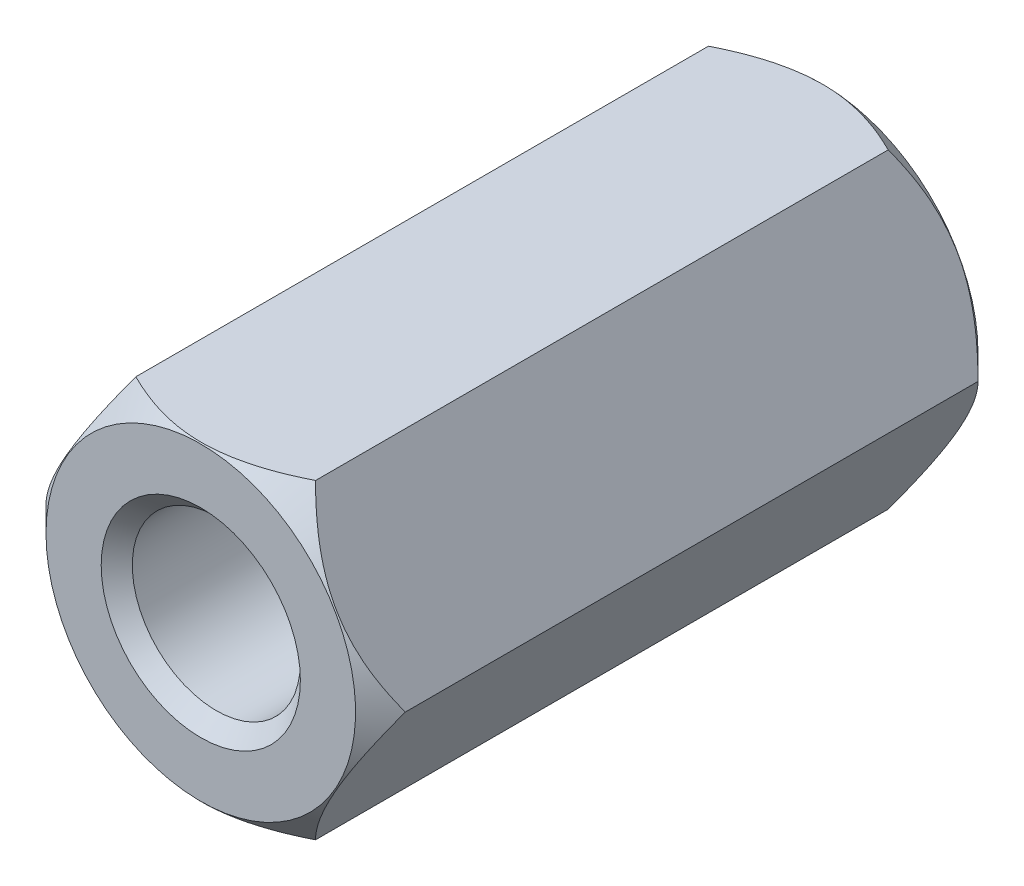
ISO-10303-21;
HEADER;
FILE_DESCRIPTION(('STEP AP214'),'2;1');
FILE_NAME('part.step','',(''),(''),'','','');
FILE_SCHEMA(('AUTOMOTIVE_DESIGN { 1 0 10303 214 1 1 1 1 }'));
ENDSEC;
DATA;
#1=APPLICATION_CONTEXT('core data for automotive mechanical design processes');
#2=APPLICATION_PROTOCOL_DEFINITION('international standard','automotive_design',2000,#1);
#3=PRODUCT_CONTEXT('',#1,'mechanical');
#4=PRODUCT('Part','Part','',(#3));
#5=PRODUCT_RELATED_PRODUCT_CATEGORY('part','',(#4));
#6=PRODUCT_DEFINITION_FORMATION('','',#4);
#7=PRODUCT_DEFINITION_CONTEXT('part definition',#1,'design');
#8=PRODUCT_DEFINITION('design','',#6,#7);
#9=PRODUCT_DEFINITION_SHAPE('','',#8);
#10=(LENGTH_UNIT() NAMED_UNIT(*) SI_UNIT(.MILLI.,.METRE.));
#11=(NAMED_UNIT(*) PLANE_ANGLE_UNIT() SI_UNIT($,.RADIAN.));
#12=(NAMED_UNIT(*) SI_UNIT($,.STERADIAN.) SOLID_ANGLE_UNIT());
#13=UNCERTAINTY_MEASURE_WITH_UNIT(LENGTH_MEASURE(1.E-05),#10,'distance_accuracy_value','');
#14=(GEOMETRIC_REPRESENTATION_CONTEXT(3) GLOBAL_UNCERTAINTY_ASSIGNED_CONTEXT((#13)) GLOBAL_UNIT_ASSIGNED_CONTEXT((#10,
#11,#12)) REPRESENTATION_CONTEXT('',''));
#15=CARTESIAN_POINT('',(0.,0.,0.));
#16=DIRECTION('',(0.,0.,1.));
#17=DIRECTION('',(1.,0.,0.));
#18=AXIS2_PLACEMENT_3D('',#15,#16,#17);
#19=CARTESIAN_POINT('',(1.44337567297409,-2.49999999999998,5.));
#20=DIRECTION('',(-0.866025403784442,0.499999999999995,0.));
#21=DIRECTION('',(-0.499999999999995,-0.866025403784442,0.));
#22=AXIS2_PLACEMENT_3D('',#19,#20,#21);
#23=PLANE('',#22);
#24=DIRECTION('',(0.,0.,1.));
#25=VECTOR('',#24,1.);
#26=CARTESIAN_POINT('',(1.44337567297409,-2.49999999999998,5.));
#27=LINE('',#26,#25);
#28=CARTESIAN_POINT('',(1.44337563619233,-2.49999999999998,4.60000001832259));
#29=VERTEX_POINT('',#28);
#30=CARTESIAN_POINT('',(1.44337569137427,-2.49999996812994,-4.60000001833188));
#31=VERTEX_POINT('',#30);
#32=EDGE_CURVE('E230',#29,#31,#27,.F.);
#33=ORIENTED_EDGE('',*,*,#32,.T.);
#34=CARTESIAN_POINT('',(2.88675134591674,-4.02492549421299E-11,-4.59999999995311));
#35=CARTESIAN_POINT('',(2.8371418191618,-0.0859262209282958,-4.64956191743451));
#36=CARTESIAN_POINT('',(2.78670282009929,-0.173289129991202,-4.69621249943633));
#37=CARTESIAN_POINT('',(2.68385252484558,-0.351431066946827,-4.78162772356207));
#38=CARTESIAN_POINT('',(2.6314314529305,-0.442227026889953,-4.82034485621288));
#39=CARTESIAN_POINT('',(2.52572693265171,-0.625312626601804,-4.88666756500361));
#40=CARTESIAN_POINT('',(2.47247038953042,-0.717555665123614,-4.91443979576514));
#41=CARTESIAN_POINT('',(2.3647851861995,-0.90407190851635,-4.95722820687064));
#42=CARTESIAN_POINT('',(2.31035981325302,-0.998339419680469,-4.97227631517235));
#43=CARTESIAN_POINT('',(2.21655517569261,-1.16081381792064,-4.98585394944047));
#44=CARTESIAN_POINT('',(2.17729701313156,-1.22881095008819,-4.98786327173912));
#45=CARTESIAN_POINT('',(2.09884492069937,-1.36469396014085,-4.98447379968523));
#46=CARTESIAN_POINT('',(2.05965101816243,-1.43257979068173,-4.97907240872174));
#47=CARTESIAN_POINT('',(1.98163336093589,-1.56771033688559,-4.96116888901889));
#48=CARTESIAN_POINT('',(1.94281006951908,-1.63495425013656,-4.94865882131304));
#49=CARTESIAN_POINT('',(1.86583485788668,-1.76827922760725,-4.91722463172509));
#50=CARTESIAN_POINT('',(1.82768288641831,-1.83436038059938,-4.89830100174918));
#51=CARTESIAN_POINT('',(1.72998211153546,-2.00358308663533,-4.84213570255329));
#52=CARTESIAN_POINT('',(1.67103848734125,-2.10567643852194,-4.80066503724302));
#53=CARTESIAN_POINT('',(1.58436641863861,-2.25579686511202,-4.73065889043091));
#54=CARTESIAN_POINT('',(1.55580401039688,-2.30526840737322,-4.70606226595184));
#55=CARTESIAN_POINT('',(1.49920805534924,-2.40329547701863,-4.6546271777928));
#56=CARTESIAN_POINT('',(1.47117419716232,-2.45185154373055,-4.62779008804468));
#57=CARTESIAN_POINT('',(1.44337570977445,-2.4999999362599,-4.60000003673206));
#58=B_SPLINE_CURVE_WITH_KNOTS('',3,(#34,#35,#36,#37,#38,#39,#40,#41,#42,#43,#44,#45,#46,#47,#48,
#49,#50,#51,#52,#53,#54,#55,#56,#57),.UNSPECIFIED.,.F.,.F.,(4,2,2,2,2,2,2,2,2,2,2,4),(0.,
0.332957366229107,0.667853853220549,0.997433316790218,1.32618330920712,1.56147590697787,
1.79685096906297,2.03248941598652,2.26810979404505,2.64223178456954,2.82878531065978,
3.01522526430085),.UNSPECIFIED.);
#59=CARTESIAN_POINT('',(2.88675134590709,0.,-4.60000000001263));
#60=VERTEX_POINT('',#59);
#61=EDGE_CURVE('E95',#60,#31,#58,.T.);
#62=ORIENTED_EDGE('',*,*,#61,.F.);
#63=DIRECTION('',(0.,0.,1.));
#64=VECTOR('',#63,1.);
#65=CARTESIAN_POINT('',(2.88675134594813,0.,5.));
#66=LINE('',#65,#64);
#67=CARTESIAN_POINT('',(2.88675134590709,0.,4.60000000001492));
#68=VERTEX_POINT('',#67);
#69=EDGE_CURVE('E65',#60,#68,#66,.T.);
#70=ORIENTED_EDGE('',*,*,#69,.T.);
#71=CARTESIAN_POINT('',(1.44337563569214,-2.50000000335731,4.59999997237826));
#72=CARTESIAN_POINT('',(1.49298517776513,-2.41407379513614,4.64956189965564));
#73=CARTESIAN_POINT('',(1.54342418333479,-2.32671089091906,4.69621248633862));
#74=CARTESIAN_POINT('',(1.64627448377127,-2.14856895685303,4.78162771524642));
#75=CARTESIAN_POINT('',(1.69869555431391,-2.05777299491776,4.82034484798485));
#76=CARTESIAN_POINT('',(1.80440007386032,-1.87468739333722,4.88666755810053));
#77=CARTESIAN_POINT('',(1.85765661758234,-1.78244435491911,4.91443979011118));
#78=CARTESIAN_POINT('',(1.96534182164683,-1.59592811107846,4.95722820342519));
#79=CARTESIAN_POINT('',(2.01976719472833,-1.50166059936262,4.97227631267816));
#80=CARTESIAN_POINT('',(2.11357183231561,-1.33918620091644,4.98585394851478));
#81=CARTESIAN_POINT('',(2.15282999470817,-1.2711890690894,4.98786327150813));
#82=CARTESIAN_POINT('',(2.23128208679937,-1.13530605966303,4.98447380088798));
#83=CARTESIAN_POINT('',(2.27047598916384,-1.06742022940783,4.97907241066636));
#84=CARTESIAN_POINT('',(2.3484936461365,-0.932289683634123,4.96116889245618));
#85=CARTESIAN_POINT('',(2.3873169374714,-0.86504577052851,4.94865882549196));
#86=CARTESIAN_POINT('',(2.46429214896885,-0.731720793294173,4.91722463734702));
#87=CARTESIAN_POINT('',(2.50244412038407,-0.665639640393218,4.89830100807152));
#88=CARTESIAN_POINT('',(2.60014490401217,-0.496416919208966,4.84213570551786));
#89=CARTESIAN_POINT('',(2.65908853672277,-0.39432355257206,4.80066503403214));
#90=CARTESIAN_POINT('',(2.74576061767448,-0.244203104766166,4.7306588759134));
#91=CARTESIAN_POINT('',(2.77432302989559,-0.194731555612454,4.70606224734313));
#92=CARTESIAN_POINT('',(2.83091899275045,-0.0967044724444769,4.65462715046795));
#93=CARTESIAN_POINT('',(2.85895285476548,-0.0481483991020447,4.62779005609599));
#94=CARTESIAN_POINT('',(2.88675134592334,-4.29361050780274E-11,4.5999999999565));
#95=B_SPLINE_CURVE_WITH_KNOTS('',3,(#71,#72,#73,#74,#75,#76,#77,#78,#79,#80,#81,#82,#83,#84,#85,
#86,#87,#88,#89,#90,#91,#92,#93,#94),.UNSPECIFIED.,.F.,.F.,(4,2,2,2,2,2,2,2,2,2,2,4),(0.,
0.332957369520453,0.667853859287211,0.997433324568728,1.32618331892462,1.56147591563137,
1.79685097656311,2.03248942263669,2.26810979988192,2.64223184439898,2.82878539726489,
3.01522537760101),.UNSPECIFIED.);
#96=EDGE_CURVE('E94',#29,#68,#95,.T.);
#97=ORIENTED_EDGE('',*,*,#96,.F.);
#98=EDGE_LOOP('',(#33,#62,#70,#97));
#99=FACE_BOUND('',#98,.T.);
#100=ADVANCED_FACE('F47',(#99),#23,.F.);
#101=CARTESIAN_POINT('',(-1.44337567297404,-2.50000000000001,5.));
#102=DIRECTION('',(0.,1.,0.));
#103=DIRECTION('',(-1.,0.,0.));
#104=AXIS2_PLACEMENT_3D('',#101,#102,#103);
#105=PLANE('',#104);
#106=DIRECTION('',(0.,0.,1.));
#107=VECTOR('',#106,1.);
#108=CARTESIAN_POINT('',(-1.44337567297404,-2.50000000000002,5.));
#109=LINE('',#108,#107);
#110=CARTESIAN_POINT('',(-1.44337569137166,-2.49999996813441,4.60000001832932));
#111=VERTEX_POINT('',#110);
#112=CARTESIAN_POINT('',(-1.44337563619207,-2.50000000000002,-4.6000000183227));
#113=VERTEX_POINT('',#112);
#114=EDGE_CURVE('E351',#111,#113,#109,.F.);
#115=ORIENTED_EDGE('',*,*,#114,.T.);
#116=CARTESIAN_POINT('',(1.44337569447336,-2.49999996937073,-4.59999997239148));
#117=CARTESIAN_POINT('',(1.34415664433493,-2.49999998897878,-4.64956189964083));
#118=CARTESIAN_POINT('',(1.24327864721911,-2.49999999704067,-4.69621248629585));
#119=CARTESIAN_POINT('',(1.03757805676238,-2.50000000297654,-4.78162771515671));
#120=CARTESIAN_POINT('',(0.932735911966666,-2.50000000079093,-4.82034484787619));
#121=CARTESIAN_POINT('',(0.721326870173406,-2.49999999922161,-4.88666755801373));
#122=CARTESIAN_POINT('',(0.614813783659037,-2.49999999979398,-4.91443979005194));
#123=CARTESIAN_POINT('',(0.39944337611681,-2.50000000020549,-4.9572282034068));
#124=CARTESIAN_POINT('',(0.290592629614107,-2.50000000004649,-4.97227631267311));
#125=CARTESIAN_POINT('',(0.102983354212486,-2.49999999996672,-4.9858539485164));
#126=CARTESIAN_POINT('',(0.0244670294454347,-2.49999999999108,-4.98786327150934));
#127=CARTESIAN_POINT('',(-0.13243715475442,-2.50000000000892,-4.9844738008838));
#128=CARTESIAN_POINT('',(-0.21082495951892,-2.5000000000024,-4.97907241065717));
#129=CARTESIAN_POINT('',(-0.366860273471372,-2.49999999999761,-4.96116889243852));
#130=CARTESIAN_POINT('',(-0.444506856113246,-2.49999999999935,-4.94865882547525));
#131=CARTESIAN_POINT('',(-0.598457279056687,-2.50000000000066,-4.91722463733641));
#132=CARTESIAN_POINT('',(-0.674761221863618,-2.50000000000021,-4.89830100806614));
#133=CARTESIAN_POINT('',(-0.870162775889693,-2.49999999999968,-4.84213570931604));
#134=CARTESIAN_POINT('',(-0.988050028541752,-2.49999999999994,-4.80066504317144));
#135=CARTESIAN_POINT('',(-1.161394172063,-2.50000000000004,-4.73065889450614));
#136=CARTESIAN_POINT('',(-1.21851899052129,-2.50000000000003,-4.706062269318));
#137=CARTESIAN_POINT('',(-1.33171090449126,-2.5,-4.65462717957893));
#138=CARTESIAN_POINT('',(-1.38777862276505,-2.49999999999998,-4.62779008896007));
#139=CARTESIAN_POINT('',(-1.44337559941009,-2.50000000000001,-4.60000003671368));
#140=B_SPLINE_CURVE_WITH_KNOTS('',3,(#116,#117,#118,#119,#120,#121,#122,#123,#124,#125,#126,
#127,#128,#129,#130,#131,#132,#133,#134,#135,#136,#137,#138,#139),.UNSPECIFIED.,.F.,.F.,(4,2,2,
2,2,2,2,2,2,2,2,4),(0.,0.332957369297533,0.667853858841152,0.997433324319791,1.32618331887115,
1.56147591564986,1.7968509766547,2.03248942265513,2.26810979982337,2.64223180313988,
2.82878533550999,3.01522529541622),.UNSPECIFIED.);
#141=EDGE_CURVE('E256',#31,#113,#140,.T.);
#142=ORIENTED_EDGE('',*,*,#141,.F.);
#143=ORIENTED_EDGE('',*,*,#32,.F.);
#144=CARTESIAN_POINT('',(-1.44337569449169,-2.49999996937692,4.59999997238567));
#145=CARTESIAN_POINT('',(-1.34415664435122,-2.49999998898103,4.64956189963431));
#146=CARTESIAN_POINT('',(-1.24327864723382,-2.49999999704129,4.69621248628963));
#147=CARTESIAN_POINT('',(-1.03757805677417,-2.50000000297597,4.78162771515189));
#148=CARTESIAN_POINT('',(-0.932735911977128,-2.50000000079079,4.82034484787248));
#149=CARTESIAN_POINT('',(-0.721326870180993,-2.49999999922178,4.88666755801174));
#150=CARTESIAN_POINT('',(-0.61481378366508,-2.49999999979403,4.91443979005057));
#151=CARTESIAN_POINT('',(-0.399443376119731,-2.50000000020546,4.95722820340637));
#152=CARTESIAN_POINT('',(-0.290592629615449,-2.50000000004649,4.97227631267301));
#153=CARTESIAN_POINT('',(-0.102983354212091,-2.49999999996673,4.98585394851642));
#154=CARTESIAN_POINT('',(-0.0244670294448954,-2.49999999999108,4.98786327150935));
#155=CARTESIAN_POINT('',(0.132437154755252,-2.50000000000892,4.98447380088377));
#156=CARTESIAN_POINT('',(0.210824959519899,-2.50000000000239,4.9790724106571));
#157=CARTESIAN_POINT('',(0.366860273472621,-2.4999999999976,4.96116889243835));
#158=CARTESIAN_POINT('',(0.444506856114617,-2.49999999999934,4.94865882547502));
#159=CARTESIAN_POINT('',(0.598457279058291,-2.50000000000064,4.91722463733605));
#160=CARTESIAN_POINT('',(0.674761221865334,-2.5000000000002,4.89830100806571));
#161=CARTESIAN_POINT('',(0.87016277589126,-2.49999999999966,4.84213570931553));
#162=CARTESIAN_POINT('',(0.988050028543065,-2.49999999999992,4.80066504317097));
#163=CARTESIAN_POINT('',(1.16139417206397,-2.50000000000002,4.73065889450575));
#164=CARTESIAN_POINT('',(1.21851899052215,-2.5,4.70606226931764));
#165=CARTESIAN_POINT('',(1.33171090449192,-2.49999999999997,4.65462717957864));
#166=CARTESIAN_POINT('',(1.38777862276561,-2.49999999999995,4.62779008895982));
#167=CARTESIAN_POINT('',(1.44337559941056,-2.49999999999998,4.60000003671347));
#168=B_SPLINE_CURVE_WITH_KNOTS('',3,(#144,#145,#146,#147,#148,#149,#150,#151,#152,#153,#154,
#155,#156,#157,#158,#159,#160,#161,#162,#163,#164,#165,#166,#167),.UNSPECIFIED.,.F.,.F.,(4,2,2,
2,2,2,2,2,2,2,2,4),(0.,0.332957369302233,0.667853858850776,0.997433324334313,1.32618331889047,
1.5614759156696,1.7968509766749,2.03248942267571,2.26810979984433,2.6422318031601,
2.82878533552989,3.0152252954358),.UNSPECIFIED.);
#169=EDGE_CURVE('E110',#111,#29,#168,.T.);
#170=ORIENTED_EDGE('',*,*,#169,.F.);
#171=EDGE_LOOP('',(#115,#142,#143,#170));
#172=FACE_BOUND('',#171,.T.);
#173=ADVANCED_FACE('F182',(#172),#105,.F.);
#174=CARTESIAN_POINT('',(-2.88675134594813,0.,5.));
#175=DIRECTION('',(0.866025403784435,0.500000000000007,0.));
#176=DIRECTION('',(-0.500000000000007,0.866025403784435,0.));
#177=AXIS2_PLACEMENT_3D('',#174,#175,#176);
#178=PLANE('',#177);
#179=DIRECTION('',(0.,0.,1.));
#180=VECTOR('',#179,1.);
#181=CARTESIAN_POINT('',(-2.88675134594813,0.,5.));
#182=LINE('',#181,#180);
#183=CARTESIAN_POINT('',(-2.88675134590709,0.,4.60000000001492));
#184=VERTEX_POINT('',#183);
#185=CARTESIAN_POINT('',(-2.88675134591028,0.,-4.6000000000106));
#186=VERTEX_POINT('',#185);
#187=EDGE_CURVE('E348',#184,#186,#182,.F.);
#188=ORIENTED_EDGE('',*,*,#187,.T.);
#189=CARTESIAN_POINT('',(-1.44337563569177,-2.5000000033576,-4.59999997237799));
#190=CARTESIAN_POINT('',(-1.49298517776484,-2.41407379513648,-4.64956189965543));
#191=CARTESIAN_POINT('',(-1.54342418333454,-2.3267108909194,-4.69621248633845));
#192=CARTESIAN_POINT('',(-1.64627448377107,-2.14856895685336,-4.7816277152463));
#193=CARTESIAN_POINT('',(-1.69869555431372,-2.05777299491806,-4.82034484798475));
#194=CARTESIAN_POINT('',(-1.80440007386014,-1.87468739333748,-4.88666755810046));
#195=CARTESIAN_POINT('',(-1.85765661758218,-1.78244435491935,-4.91443979011113));
#196=CARTESIAN_POINT('',(-1.9653418216467,-1.59592811107866,-4.95722820342517));
#197=CARTESIAN_POINT('',(-2.01976719472821,-1.5016605993628,-4.97227631267815));
#198=CARTESIAN_POINT('',(-2.1135718323155,-1.3391862009166,-4.98585394851478));
#199=CARTESIAN_POINT('',(-2.15282999470807,-1.27118906908957,-4.98786327150814));
#200=CARTESIAN_POINT('',(-2.23128208679926,-1.1353060596632,-4.984473800888));
#201=CARTESIAN_POINT('',(-2.27047598916373,-1.067420229408,-4.97907241066639));
#202=CARTESIAN_POINT('',(-2.3484936461364,-0.932289683634292,-4.96116889245622));
#203=CARTESIAN_POINT('',(-2.3873169374713,-0.86504577052868,-4.948658825492));
#204=CARTESIAN_POINT('',(-2.46429214896875,-0.731720793294344,-4.91722463734707));
#205=CARTESIAN_POINT('',(-2.50244412038397,-0.665639640393389,-4.89830100807157));
#206=CARTESIAN_POINT('',(-2.60014490401209,-0.49641691920911,-4.84213570551791));
#207=CARTESIAN_POINT('',(-2.65908853672271,-0.394323552572177,-4.80066503403218));
#208=CARTESIAN_POINT('',(-2.74576061767444,-0.244203104766245,-4.73065887591343));
#209=CARTESIAN_POINT('',(-2.77432302989556,-0.19473155561252,-4.70606224734316));
#210=CARTESIAN_POINT('',(-2.83091899275044,-0.0967044724445189,-4.65462715046796));
#211=CARTESIAN_POINT('',(-2.85895285476547,-0.0481483991020748,-4.627790056096));
#212=CARTESIAN_POINT('',(-2.88675134592334,-4.29543286021735E-11,-4.5999999999565));
#213=B_SPLINE_CURVE_WITH_KNOTS('',3,(#189,#190,#191,#192,#193,#194,#195,#196,#197,#198,#199,
#200,#201,#202,#203,#204,#205,#206,#207,#208,#209,#210,#211,#212),.UNSPECIFIED.,.F.,.F.,(4,2,2,
2,2,2,2,2,2,2,2,4),(0.,0.332957369520536,0.667853859287378,0.997433324568973,1.32618331892494,
1.56147591563169,1.79685097656343,2.032489422637,2.26810979988223,2.64223184439939,
2.82878539726534,3.01522537760151),.UNSPECIFIED.);
#214=EDGE_CURVE('E246',#113,#186,#213,.T.);
#215=ORIENTED_EDGE('',*,*,#214,.F.);
#216=ORIENTED_EDGE('',*,*,#114,.F.);
#217=CARTESIAN_POINT('',(-2.88675134591674,-4.0262391813346E-11,4.59999999995311));
#218=CARTESIAN_POINT('',(-2.8371418191618,-0.0859262209283169,4.64956191743451));
#219=CARTESIAN_POINT('',(-2.78670282009928,-0.173289129991231,4.69621249943634));
#220=CARTESIAN_POINT('',(-2.68385252484556,-0.351431066946873,4.78162772356208));
#221=CARTESIAN_POINT('',(-2.63143145293047,-0.442227026890008,4.8203448562129));
#222=CARTESIAN_POINT('',(-2.52572693265167,-0.625312626601861,4.88666756500363));
#223=CARTESIAN_POINT('',(-2.47247038953039,-0.717555665123663,4.91443979576515));
#224=CARTESIAN_POINT('',(-2.36478518619947,-0.904071908516385,4.95722820687065));
#225=CARTESIAN_POINT('',(-2.31035981325299,-0.998339419680497,4.97227631517236));
#226=CARTESIAN_POINT('',(-2.2165551756926,-1.16081381792065,4.98585394944048));
#227=CARTESIAN_POINT('',(-2.17729701313154,-1.22881095008821,4.98786327173913));
#228=CARTESIAN_POINT('',(-2.09884492069935,-1.36469396014085,4.98447379968524));
#229=CARTESIAN_POINT('',(-2.05965101816241,-1.43257979068173,4.97907240872175));
#230=CARTESIAN_POINT('',(-1.98163336093587,-1.56771033688559,4.96116888901891));
#231=CARTESIAN_POINT('',(-1.94281006951906,-1.63495425013656,4.94865882131306));
#232=CARTESIAN_POINT('',(-1.86583485788665,-1.76827922760725,4.9172246317251));
#233=CARTESIAN_POINT('',(-1.82768288641828,-1.83436038059939,4.89830100174919));
#234=CARTESIAN_POINT('',(-1.7299821115345,-2.00358308663694,4.84213570255278));
#235=CARTESIAN_POINT('',(-1.6710384873394,-2.1056764385251,4.80066503724176));
#236=CARTESIAN_POINT('',(-1.58436641863547,-2.2557968651174,4.73065889042832));
#237=CARTESIAN_POINT('',(-1.55580401039332,-2.30526840737933,4.70606226594878));
#238=CARTESIAN_POINT('',(-1.49920805534485,-2.40329547702616,4.65462717778874));
#239=CARTESIAN_POINT('',(-1.47117419715753,-2.45185154373878,4.6277900880401));
#240=CARTESIAN_POINT('',(-1.44337570976927,-2.49999993626881,4.60000003672693));
#241=B_SPLINE_CURVE_WITH_KNOTS('',3,(#217,#218,#219,#220,#221,#222,#223,#224,#225,#226,#227,
#228,#229,#230,#231,#232,#233,#234,#235,#236,#237,#238,#239,#240),.UNSPECIFIED.,.F.,.F.,(4,2,2,
2,2,2,2,2,2,2,2,4),(0.,0.33295736622914,0.667853853220617,0.997433316790262,1.32618330920714,
1.56147590697788,1.79685096906297,2.03248941598653,2.26810979404506,2.64223178457532,
2.82878531066843,3.01522526431236),.UNSPECIFIED.);
#242=EDGE_CURVE('E277',#184,#111,#241,.T.);
#243=ORIENTED_EDGE('',*,*,#242,.F.);
#244=EDGE_LOOP('',(#188,#215,#216,#243));
#245=FACE_BOUND('',#244,.T.);
#246=ADVANCED_FACE('F270',(#245),#178,.F.);
#247=CARTESIAN_POINT('',(-1.44337567297408,2.5,5.));
#248=DIRECTION('',(0.866025403784442,-0.499999999999995,0.));
#249=DIRECTION('',(0.499999999999995,0.866025403784442,0.));
#250=AXIS2_PLACEMENT_3D('',#247,#248,#249);
#251=PLANE('',#250);
#252=DIRECTION('',(0.,0.,1.));
#253=VECTOR('',#252,1.);
#254=CARTESIAN_POINT('',(-1.44337567297408,2.5,5.));
#255=LINE('',#254,#253);
#256=CARTESIAN_POINT('',(-1.44337563618078,2.5,4.60000001832835));
#257=VERTEX_POINT('',#256);
#258=CARTESIAN_POINT('',(-1.44337569137426,2.49999996812995,-4.60000001833188));
#259=VERTEX_POINT('',#258);
#260=EDGE_CURVE('E315',#257,#259,#255,.F.);
#261=ORIENTED_EDGE('',*,*,#260,.T.);
#262=CARTESIAN_POINT('',(-2.88675134591674,4.02321782567396E-11,-4.59999999995312));
#263=CARTESIAN_POINT('',(-2.8371418191618,0.0859262209282787,-4.64956191743451));
#264=CARTESIAN_POINT('',(-2.78670282009929,0.173289129991185,-4.69621249943634));
#265=CARTESIAN_POINT('',(-2.68385252484557,0.351431066946812,-4.78162772356207));
#266=CARTESIAN_POINT('',(-2.6314314529305,0.442227026889939,-4.82034485621288));
#267=CARTESIAN_POINT('',(-2.5257269326517,0.625312626601792,-4.88666756500362));
#268=CARTESIAN_POINT('',(-2.47247038953042,0.717555665123602,-4.91443979576514));
#269=CARTESIAN_POINT('',(-2.36478518619949,0.904071908516341,-4.95722820687064));
#270=CARTESIAN_POINT('',(-2.31035981325301,0.998339419680461,-4.97227631517236));
#271=CARTESIAN_POINT('',(-2.21655517569261,1.16081381792063,-4.98585394944048));
#272=CARTESIAN_POINT('',(-2.17729701313155,1.22881095008819,-4.98786327173913));
#273=CARTESIAN_POINT('',(-2.09884492069936,1.36469396014084,-4.98447379968523));
#274=CARTESIAN_POINT('',(-2.05965101816242,1.43257979068172,-4.97907240872175));
#275=CARTESIAN_POINT('',(-1.98163336093588,1.56771033688559,-4.9611688890189));
#276=CARTESIAN_POINT('',(-1.94281006951907,1.63495425013655,-4.94865882131305));
#277=CARTESIAN_POINT('',(-1.86583485788667,1.76827922760724,-4.9172246317251));
#278=CARTESIAN_POINT('',(-1.8276828864183,1.83436038059937,-4.89830100174919));
#279=CARTESIAN_POINT('',(-1.72998211153545,2.00358308663532,-4.8421357025533));
#280=CARTESIAN_POINT('',(-1.67103848734124,2.10567643852194,-4.80066503724303));
#281=CARTESIAN_POINT('',(-1.5843664186386,2.25579686511202,-4.73065889043092));
#282=CARTESIAN_POINT('',(-1.55580401039687,2.30526840737322,-4.70606226595185));
#283=CARTESIAN_POINT('',(-1.49920805534922,2.40329547701863,-4.6546271777928));
#284=CARTESIAN_POINT('',(-1.4711741971623,2.45185154373056,-4.62779008804468));
#285=CARTESIAN_POINT('',(-1.44337570977443,2.49999993625991,-4.60000003673206));
#286=B_SPLINE_CURVE_WITH_KNOTS('',3,(#262,#263,#264,#265,#266,#267,#268,#269,#270,#271,#272,
#273,#274,#275,#276,#277,#278,#279,#280,#281,#282,#283,#284,#285),.UNSPECIFIED.,.F.,.F.,(4,2,2,
2,2,2,2,2,2,2,2,4),(0.,0.332957366229109,0.667853853220555,0.997433316790227,1.32618330920713,
1.56147590697788,1.79685096906298,2.03248941598654,2.26810979404506,2.64223178456956,
2.82878531065981,3.01522526430088),.UNSPECIFIED.);
#287=EDGE_CURVE('E255',#186,#259,#286,.T.);
#288=ORIENTED_EDGE('',*,*,#287,.F.);
#289=ORIENTED_EDGE('',*,*,#187,.F.);
#290=CARTESIAN_POINT('',(-1.44337563569786,2.5000000033209,4.59999997238821));
#291=CARTESIAN_POINT('',(-1.49298517777617,2.41407379510748,4.6495618996674));
#292=CARTESIAN_POINT('',(-1.54342418334729,2.32671089089483,4.69621248635001));
#293=CARTESIAN_POINT('',(-1.64627448378319,2.14856895683495,4.78162771525532));
#294=CARTESIAN_POINT('',(-1.69869555432375,2.05777299490138,4.82034484799163));
#295=CARTESIAN_POINT('',(-1.80440007386683,1.87468739332524,4.88666755810406));
#296=CARTESIAN_POINT('',(-1.85765661758759,1.78244435490982,4.91443979011357));
#297=CARTESIAN_POINT('',(-1.96534182164925,1.59592811107443,4.95722820342587));
#298=CARTESIAN_POINT('',(-2.01976719472918,1.50166059936116,4.97227631267824));
#299=CARTESIAN_POINT('',(-2.11357183231476,1.33918620091785,4.9858539485147));
#300=CARTESIAN_POINT('',(-2.15282999470719,1.27118906909107,4.98786327150811));
#301=CARTESIAN_POINT('',(-2.2312820867981,1.13530605966522,4.98447380088812));
#302=CARTESIAN_POINT('',(-2.27047598916242,1.06742022941027,4.9790724106666));
#303=CARTESIAN_POINT('',(-2.34849364613481,0.932289683637035,4.96116889245667));
#304=CARTESIAN_POINT('',(-2.38731693746959,0.865045770531634,4.94865882549259));
#305=CARTESIAN_POINT('',(-2.4642921489668,0.7317207932977,4.91722463734798));
#306=CARTESIAN_POINT('',(-2.50244412038191,0.665639640396937,4.89830100807264));
#307=CARTESIAN_POINT('',(-2.60014490401033,0.496416919212142,4.84213570551911));
#308=CARTESIAN_POINT('',(-2.65908853672134,0.394323552574525,4.80066503403322));
#309=CARTESIAN_POINT('',(-2.74576061767362,0.244203104767636,4.73065887591413));
#310=CARTESIAN_POINT('',(-2.7743230298949,0.194731555613619,4.70606224734374));
#311=CARTESIAN_POINT('',(-2.83091899275011,0.096704472445045,4.65462715046827));
#312=CARTESIAN_POINT('',(-2.85895285476531,0.0481483991023194,4.62779005609616));
#313=CARTESIAN_POINT('',(-2.88675134592334,4.29219315794996E-11,4.5999999999565));
#314=B_SPLINE_CURVE_WITH_KNOTS('',3,(#290,#291,#292,#293,#294,#295,#296,#297,#298,#299,#300,
#301,#302,#303,#304,#305,#306,#307,#308,#309,#310,#311,#312,#313),.UNSPECIFIED.,.F.,.F.,(4,2,2,
2,2,2,2,2,2,2,2,4),(0.,0.332957369511547,0.667853859268945,0.99743332454112,1.32618331888787,
1.56147591559375,1.79685097652458,2.03248942259737,2.26810979984183,2.64223184436136,
2.82878539722839,3.01522537756563),.UNSPECIFIED.);
#315=EDGE_CURVE('E121',#257,#184,#314,.T.);
#316=ORIENTED_EDGE('',*,*,#315,.F.);
#317=EDGE_LOOP('',(#261,#288,#289,#316));
#318=FACE_BOUND('',#317,.T.);
#319=ADVANCED_FACE('F273',(#318),#251,.F.);
#320=CARTESIAN_POINT('',(1.44337567297406,2.50000000000001,5.));
#321=DIRECTION('',(0.,-1.,0.));
#322=DIRECTION('',(1.,0.,0.));
#323=AXIS2_PLACEMENT_3D('',#320,#321,#322);
#324=PLANE('',#323);
#325=DIRECTION('',(0.,0.,1.));
#326=VECTOR('',#325,1.);
#327=CARTESIAN_POINT('',(1.44337567297406,2.50000000000001,5.));
#328=LINE('',#327,#326);
#329=CARTESIAN_POINT('',(1.44337569137424,2.49999996812996,4.60000001833188));
#330=VERTEX_POINT('',#329);
#331=CARTESIAN_POINT('',(1.44337563617198,2.50000000000001,-4.60000001833275));
#332=VERTEX_POINT('',#331);
#333=EDGE_CURVE('E98',#330,#332,#328,.F.);
#334=ORIENTED_EDGE('',*,*,#333,.T.);
#335=CARTESIAN_POINT('',(-1.44337569447335,2.49999996937074,-4.59999997239148));
#336=CARTESIAN_POINT('',(-1.34415664433495,2.49999998897879,-4.64956189964081));
#337=CARTESIAN_POINT('',(-1.24327864721916,2.49999999704068,-4.69621248629582));
#338=CARTESIAN_POINT('',(-1.03757805676251,2.50000000297655,-4.78162771515665));
#339=CARTESIAN_POINT('',(-0.93273591196683,2.50000000079093,-4.82034484787613));
#340=CARTESIAN_POINT('',(-0.721326870173574,2.49999999922162,-4.88666755801368));
#341=CARTESIAN_POINT('',(-0.614813783659169,2.49999999979398,-4.91443979005191));
#342=CARTESIAN_POINT('',(-0.399443376116869,2.5000000002055,-4.95722820340678));
#343=CARTESIAN_POINT('',(-0.290592629614128,2.50000000004649,-4.97227631267311));
#344=CARTESIAN_POINT('',(-0.102983354212456,2.49999999996672,-4.9858539485164));
#345=CARTESIAN_POINT('',(-0.024467029445391,2.49999999999108,-4.98786327150934));
#346=CARTESIAN_POINT('',(0.132437154754491,2.50000000000892,-4.9844738008838));
#347=CARTESIAN_POINT('',(0.210824959519005,2.5000000000024,-4.97907241065717));
#348=CARTESIAN_POINT('',(0.366860273471457,2.49999999999761,-4.96116889243851));
#349=CARTESIAN_POINT('',(0.444506856113317,2.49999999999935,-4.94865882547524));
#350=CARTESIAN_POINT('',(0.598457279056731,2.50000000000065,-4.9172246373364));
#351=CARTESIAN_POINT('',(0.674761221863649,2.50000000000021,-4.89830100806614));
#352=CARTESIAN_POINT('',(0.870162775882486,2.49999999999967,-4.84213570931812));
#353=CARTESIAN_POINT('',(0.988050028527559,2.49999999999994,-4.80066504317644));
#354=CARTESIAN_POINT('',(1.16139417203875,2.50000000000004,-4.73065889451631));
#355=CARTESIAN_POINT('',(1.21851899049377,2.50000000000002,-4.70606226933002));
#356=CARTESIAN_POINT('',(1.33171090445731,2.49999999999999,-4.65462717959485));
#357=CARTESIAN_POINT('',(1.38777862272795,2.49999999999997,-4.62779008897804));
#358=CARTESIAN_POINT('',(1.44337559936989,2.50000000000001,-4.60000003673379));
#359=B_SPLINE_CURVE_WITH_KNOTS('',3,(#335,#336,#337,#338,#339,#340,#341,#342,#343,#344,#345,
#346,#347,#348,#349,#350,#351,#352,#353,#354,#355,#356,#357,#358),.UNSPECIFIED.,.F.,.F.,(4,2,2,
2,2,2,2,2,2,2,2,4),(0.,0.332957369297418,0.667853858840923,0.997433324319679,1.32618331887116,
1.5614759156499,1.79685097665478,2.03248942265517,2.26810979982337,2.64223180311734,
2.82878533547623,3.01522529537129),.UNSPECIFIED.);
#360=EDGE_CURVE('E291',#259,#332,#359,.T.);
#361=ORIENTED_EDGE('',*,*,#360,.F.);
#362=ORIENTED_EDGE('',*,*,#260,.F.);
#363=CARTESIAN_POINT('',(1.44337569447333,2.49999996937075,4.59999997239148));
#364=CARTESIAN_POINT('',(1.34415664433491,2.4999999889788,4.64956189964082));
#365=CARTESIAN_POINT('',(1.24327864721911,2.49999999704069,4.69621248629583));
#366=CARTESIAN_POINT('',(1.03757805676243,2.50000000297656,4.78162771515668));
#367=CARTESIAN_POINT('',(0.932735911966733,2.50000000079094,4.82034484787616));
#368=CARTESIAN_POINT('',(0.721326870173475,2.49999999922162,4.8866675580137));
#369=CARTESIAN_POINT('',(0.614813783659086,2.49999999979399,4.91443979005192));
#370=CARTESIAN_POINT('',(0.399443376116817,2.5000000002055,4.95722820340679));
#371=CARTESIAN_POINT('',(0.290592629614093,2.5000000000465,4.97227631267311));
#372=CARTESIAN_POINT('',(0.102983354212443,2.49999999996672,4.9858539485164));
#373=CARTESIAN_POINT('',(0.0244670294453843,2.49999999999108,4.98786327150934));
#374=CARTESIAN_POINT('',(-0.132437154754486,2.50000000000892,4.9844738008838));
#375=CARTESIAN_POINT('',(-0.210824959518994,2.50000000000239,4.97907241065717));
#376=CARTESIAN_POINT('',(-0.366860273471446,2.4999999999976,4.96116889243852));
#377=CARTESIAN_POINT('',(-0.444506856113313,2.49999999999935,4.94865882547524));
#378=CARTESIAN_POINT('',(-0.598457279056738,2.50000000000065,4.9172246373364));
#379=CARTESIAN_POINT('',(-0.674761221863662,2.50000000000021,4.89830100806614));
#380=CARTESIAN_POINT('',(-0.870162775885662,2.49999999999967,4.84213570931721));
#381=CARTESIAN_POINT('',(-0.988050028533787,2.49999999999993,4.80066504317425));
#382=CARTESIAN_POINT('',(-1.16139417204938,2.50000000000003,4.73065889451186));
#383=CARTESIAN_POINT('',(-1.21851899050582,2.50000000000001,4.70606226932477));
#384=CARTESIAN_POINT('',(-1.33171090447217,2.49999999999998,4.65462717958789));
#385=CARTESIAN_POINT('',(-1.38777862274419,2.49999999999996,4.62779008897019));
#386=CARTESIAN_POINT('',(-1.44337559938749,2.5,4.600000036725));
#387=B_SPLINE_CURVE_WITH_KNOTS('',3,(#363,#364,#365,#366,#367,#368,#369,#370,#371,#372,#373,
#374,#375,#376,#377,#378,#379,#380,#381,#382,#383,#384,#385,#386),.UNSPECIFIED.,.F.,.F.,(4,2,2,
2,2,2,2,2,2,2,2,4),(0.,0.332957369297468,0.667853858841022,0.997433324319728,1.32618331887115,
1.56147591564988,1.79685097665475,2.03248942265515,2.26810979982337,2.64223180312719,
2.82878533549098,3.01522529539092),.UNSPECIFIED.);
#388=EDGE_CURVE('E117',#330,#257,#387,.T.);
#389=ORIENTED_EDGE('',*,*,#388,.F.);
#390=EDGE_LOOP('',(#334,#361,#362,#389));
#391=FACE_BOUND('',#390,.T.);
#392=ADVANCED_FACE('F303',(#391),#324,.F.);
#393=CARTESIAN_POINT('',(2.88675134594813,0.,5.));
#394=DIRECTION('',(-0.866025403784438,-0.500000000000001,0.));
#395=DIRECTION('',(0.500000000000001,-0.866025403784438,0.));
#396=AXIS2_PLACEMENT_3D('',#393,#394,#395);
#397=PLANE('',#396);
#398=ORIENTED_EDGE('',*,*,#69,.F.);
#399=CARTESIAN_POINT('',(1.44337563569604,2.50000000330642,-4.5999999723892));
#400=CARTESIAN_POINT('',(1.49298517777821,2.41407379509759,-4.64956189967022));
#401=CARTESIAN_POINT('',(1.54342418335065,2.32671089088729,-4.6962124863532));
#402=CARTESIAN_POINT('',(1.64627448378688,2.14856895683025,-4.78162771525801));
#403=CARTESIAN_POINT('',(1.69869555432644,2.05777299489716,-4.82034484799346));
#404=CARTESIAN_POINT('',(1.80440007386808,1.87468739332262,-4.88666755810472));
#405=CARTESIAN_POINT('',(1.8576566175884,1.78244435490829,-4.91443979011391));
#406=CARTESIAN_POINT('',(1.96534182164899,1.59592811107499,-4.95722820342576));
#407=CARTESIAN_POINT('',(2.0197671947283,1.50166059936271,-4.97227631267799));
#408=CARTESIAN_POINT('',(2.1135718323132,1.33918620092053,-4.98585394851457));
#409=CARTESIAN_POINT('',(2.15282999470556,1.2711890690939,-4.98786327150807));
#410=CARTESIAN_POINT('',(2.23128208679631,1.13530605966832,-4.98447380088831));
#411=CARTESIAN_POINT('',(2.27047598916055,1.06742022941351,-4.97907241066691));
#412=CARTESIAN_POINT('',(2.3484936461328,0.932289683640511,-4.96116889245725));
#413=CARTESIAN_POINT('',(2.38731693746752,0.865045770535214,-4.94865882549331));
#414=CARTESIAN_POINT('',(2.46429214896463,0.731720793301476,-4.91722463734899));
#415=CARTESIAN_POINT('',(2.50244412037968,0.665639640400805,-4.8983010080738));
#416=CARTESIAN_POINT('',(2.60014490400847,0.496416919215378,-4.84213570552037));
#417=CARTESIAN_POINT('',(2.65908853671988,0.394323552577061,-4.80066503403432));
#418=CARTESIAN_POINT('',(2.74576061767274,0.244203104769179,-4.73065887591488));
#419=CARTESIAN_POINT('',(2.7743230298942,0.194731555614849,-4.70606224734436));
#420=CARTESIAN_POINT('',(2.83091899274977,0.0967044724456584,-4.6546271504686));
#421=CARTESIAN_POINT('',(2.85895285476514,0.0481483991026306,-4.62779005609633));
#422=CARTESIAN_POINT('',(2.88675134592334,4.29360516864112E-11,-4.5999999999565));
#423=B_SPLINE_CURVE_WITH_KNOTS('',3,(#399,#400,#401,#402,#403,#404,#405,#406,#407,#408,#409,
#410,#411,#412,#413,#414,#415,#416,#417,#418,#419,#420,#421,#422),.UNSPECIFIED.,.F.,.F.,(4,2,2,
2,2,2,2,2,2,2,2,4),(0.,0.332957369508255,0.667853859262117,0.997433324530693,1.32618331887395,
1.56147591557936,1.7968509765097,2.03248942258207,2.26810979982612,2.64223184434808,
2.82878539721626,3.01522537755464),.UNSPECIFIED.);
#424=EDGE_CURVE('E226',#332,#60,#423,.T.);
#425=ORIENTED_EDGE('',*,*,#424,.F.);
#426=ORIENTED_EDGE('',*,*,#333,.F.);
#427=CARTESIAN_POINT('',(2.88675134591674,4.02490692543604E-11,4.59999999995311));
#428=CARTESIAN_POINT('',(2.8371418191618,0.0859262209282959,4.64956191743451));
#429=CARTESIAN_POINT('',(2.78670282009929,0.173289129991202,4.69621249943634));
#430=CARTESIAN_POINT('',(2.68385252484557,0.351431066946829,4.78162772356207));
#431=CARTESIAN_POINT('',(2.6314314529305,0.442227026889955,4.82034485621288));
#432=CARTESIAN_POINT('',(2.5257269326517,0.625312626601808,4.88666756500362));
#433=CARTESIAN_POINT('',(2.47247038953041,0.717555665123618,4.91443979576514));
#434=CARTESIAN_POINT('',(2.36478518619949,0.904071908516357,4.95722820687064));
#435=CARTESIAN_POINT('',(2.310359813253,0.998339419680476,4.97227631517236));
#436=CARTESIAN_POINT('',(2.2165551756926,1.16081381792064,4.98585394944048));
#437=CARTESIAN_POINT('',(2.17729701313154,1.2288109500882,4.98786327173913));
#438=CARTESIAN_POINT('',(2.09884492069935,1.36469396014085,4.98447379968523));
#439=CARTESIAN_POINT('',(2.05965101816241,1.43257979068173,4.97907240872175));
#440=CARTESIAN_POINT('',(1.98163336093587,1.5677103368856,4.9611688890189));
#441=CARTESIAN_POINT('',(1.94281006951906,1.63495425013656,4.94865882131305));
#442=CARTESIAN_POINT('',(1.86583485788666,1.76827922760725,4.9172246317251));
#443=CARTESIAN_POINT('',(1.82768288641829,1.83436038059938,4.89830100174919));
#444=CARTESIAN_POINT('',(1.72998211153544,2.00358308663533,4.8421357025533));
#445=CARTESIAN_POINT('',(1.67103848734123,2.10567643852195,4.80066503724303));
#446=CARTESIAN_POINT('',(1.58436641863858,2.25579686511203,4.73065889043092));
#447=CARTESIAN_POINT('',(1.55580401039685,2.30526840737323,4.70606226595185));
#448=CARTESIAN_POINT('',(1.4992080553492,2.40329547701864,4.6546271777928));
#449=CARTESIAN_POINT('',(1.47117419716228,2.45185154373057,4.62779008804468));
#450=CARTESIAN_POINT('',(1.44337570977442,2.49999993625992,4.60000003673206));
#451=B_SPLINE_CURVE_WITH_KNOTS('',3,(#427,#428,#429,#430,#431,#432,#433,#434,#435,#436,#437,
#438,#439,#440,#441,#442,#443,#444,#445,#446,#447,#448,#449,#450),.UNSPECIFIED.,.F.,.F.,(4,2,2,
2,2,2,2,2,2,2,2,4),(0.,0.33295736622911,0.667853853220557,0.997433316790231,1.32618330920713,
1.56147590697789,1.79685096906298,2.03248941598654,2.26810979404506,2.64223178456957,
2.82878531065982,3.01522526430089),.UNSPECIFIED.);
#452=EDGE_CURVE('E97',#68,#330,#451,.T.);
#453=ORIENTED_EDGE('',*,*,#452,.F.);
#454=EDGE_LOOP('',(#398,#425,#426,#453));
#455=FACE_BOUND('',#454,.T.);
#456=ADVANCED_FACE('F114',(#455),#397,.F.);
#457=CARTESIAN_POINT('',(0.,0.,4.59760000006781));
#458=DIRECTION('',(0.,0.,-1.));
#459=DIRECTION('',(-1.,0.,0.));
#460=AXIS2_PLACEMENT_3D('',#457,#458,#459);
#461=CONICAL_SURFACE('',#460,2.88915134581202,0.785398163397448);
#462=ORIENTED_EDGE('',*,*,#315,.T.);
#463=ORIENTED_EDGE('',*,*,#242,.T.);
#464=ORIENTED_EDGE('',*,*,#169,.T.);
#465=ORIENTED_EDGE('',*,*,#96,.T.);
#466=ORIENTED_EDGE('',*,*,#452,.T.);
#467=ORIENTED_EDGE('',*,*,#388,.T.);
#468=EDGE_LOOP('',(#462,#463,#464,#465,#466,#467));
#469=FACE_BOUND('',#468,.T.);
#470=CARTESIAN_POINT('',(0.,0.,4.99999999999545));
#471=DIRECTION('',(0.,0.,-1.));
#472=DIRECTION('',(-1.,0.,0.));
#473=AXIS2_PLACEMENT_3D('',#470,#471,#472);
#474=CIRCLE('',#473,2.48675134588439);
#475=CARTESIAN_POINT('',(-2.48675134588439,0.,4.99999999999545));
#476=VERTEX_POINT('',#475);
#477=EDGE_CURVE('E219',#476,#476,#474,.F.);
#478=ORIENTED_EDGE('',*,*,#477,.F.);
#479=EDGE_LOOP('',(#478));
#480=FACE_BOUND('',#479,.T.);
#481=ADVANCED_FACE('F104',(#469,#480),#461,.T.);
#482=CARTESIAN_POINT('',(0.,0.,-4.59760000006781));
#483=DIRECTION('',(0.,0.,1.));
#484=DIRECTION('',(1.,0.,0.));
#485=AXIS2_PLACEMENT_3D('',#482,#483,#484);
#486=CONICAL_SURFACE('',#485,2.88915134581202,0.785398163397448);
#487=ORIENTED_EDGE('',*,*,#214,.T.);
#488=ORIENTED_EDGE('',*,*,#287,.T.);
#489=ORIENTED_EDGE('',*,*,#360,.T.);
#490=ORIENTED_EDGE('',*,*,#424,.T.);
#491=ORIENTED_EDGE('',*,*,#61,.T.);
#492=ORIENTED_EDGE('',*,*,#141,.T.);
#493=EDGE_LOOP('',(#487,#488,#489,#490,#491,#492));
#494=FACE_BOUND('',#493,.T.);
#495=CARTESIAN_POINT('',(0.,0.,-4.99999999999545));
#496=DIRECTION('',(0.,0.,1.));
#497=DIRECTION('',(1.,0.,0.));
#498=AXIS2_PLACEMENT_3D('',#495,#496,#497);
#499=CIRCLE('',#498,2.48675134588439);
#500=CARTESIAN_POINT('',(2.48675134588439,0.,-4.99999999999545));
#501=VERTEX_POINT('',#500);
#502=EDGE_CURVE('E216',#501,#501,#499,.T.);
#503=ORIENTED_EDGE('',*,*,#502,.T.);
#504=EDGE_LOOP('',(#503));
#505=FACE_BOUND('',#504,.T.);
#506=ADVANCED_FACE('F145',(#494,#505),#486,.T.);
#507=CARTESIAN_POINT('',(0.,0.,5.));
#508=DIRECTION('',(0.,0.,1.));
#509=DIRECTION('',(1.,0.,0.));
#510=AXIS2_PLACEMENT_3D('',#507,#508,#509);
#511=PLANE('',#510);
#512=CARTESIAN_POINT('',(0.,0.,5.));
#513=DIRECTION('',(0.,0.,1.));
#514=DIRECTION('',(1.,0.,0.));
#515=AXIS2_PLACEMENT_3D('',#512,#513,#514);
#516=CIRCLE('',#515,1.59999999995157);
#517=CARTESIAN_POINT('',(1.59999999995157,0.,5.));
#518=VERTEX_POINT('',#517);
#519=EDGE_CURVE('E12',#518,#518,#516,.F.);
#520=ORIENTED_EDGE('',*,*,#519,.T.);
#521=EDGE_LOOP('',(#520));
#522=FACE_BOUND('',#521,.T.);
#523=ORIENTED_EDGE('',*,*,#477,.T.);
#524=EDGE_LOOP('',(#523));
#525=FACE_BOUND('',#524,.T.);
#526=ADVANCED_FACE('F204',(#522,#525),#511,.T.);
#527=CARTESIAN_POINT('',(0.,0.,-5.));
#528=DIRECTION('',(0.,0.,1.));
#529=DIRECTION('',(1.,0.,0.));
#530=AXIS2_PLACEMENT_3D('',#527,#528,#529);
#531=PLANE('',#530);
#532=CARTESIAN_POINT('',(0.,0.,-5.));
#533=DIRECTION('',(0.,0.,1.));
#534=DIRECTION('',(1.,0.,0.));
#535=AXIS2_PLACEMENT_3D('',#532,#533,#534);
#536=CIRCLE('',#535,1.59999999995611);
#537=CARTESIAN_POINT('',(1.59999999995611,0.,-5.));
#538=VERTEX_POINT('',#537);
#539=EDGE_CURVE('E138',#538,#538,#536,.T.);
#540=ORIENTED_EDGE('',*,*,#539,.T.);
#541=EDGE_LOOP('',(#540));
#542=FACE_BOUND('',#541,.T.);
#543=ORIENTED_EDGE('',*,*,#502,.F.);
#544=EDGE_LOOP('',(#543));
#545=FACE_BOUND('',#544,.T.);
#546=ADVANCED_FACE('F198',(#542,#545),#531,.F.);
#547=CARTESIAN_POINT('',(0.,0.,5.));
#548=DIRECTION('',(0.,0.,1.));
#549=DIRECTION('',(1.,0.,0.));
#550=AXIS2_PLACEMENT_3D('',#547,#548,#549);
#551=CYLINDRICAL_SURFACE('',#550,1.35);
#552=CARTESIAN_POINT('',(0.,0.,-4.75000000004388));
#553=DIRECTION('',(0.,0.,1.));
#554=DIRECTION('',(1.,0.,0.));
#555=AXIS2_PLACEMENT_3D('',#552,#553,#554);
#556=CIRCLE('',#555,1.35);
#557=CARTESIAN_POINT('',(1.35,0.,-4.75000000004388));
#558=VERTEX_POINT('',#557);
#559=EDGE_CURVE('E57',#558,#558,#556,.F.);
#560=ORIENTED_EDGE('',*,*,#559,.T.);
#561=EDGE_LOOP('',(#560));
#562=FACE_BOUND('',#561,.T.);
#563=CARTESIAN_POINT('',(0.,0.,4.75000000004843));
#564=DIRECTION('',(0.,0.,1.));
#565=DIRECTION('',(1.,0.,0.));
#566=AXIS2_PLACEMENT_3D('',#563,#564,#565);
#567=CIRCLE('',#566,1.35);
#568=CARTESIAN_POINT('',(1.35,0.,4.75000000004843));
#569=VERTEX_POINT('',#568);
#570=EDGE_CURVE('E224',#569,#569,#567,.T.);
#571=ORIENTED_EDGE('',*,*,#570,.T.);
#572=EDGE_LOOP('',(#571));
#573=FACE_BOUND('',#572,.T.);
#574=ADVANCED_FACE('F183',(#562,#573),#551,.F.);
#575=CARTESIAN_POINT('',(0.,0.,-5.));
#576=DIRECTION('',(0.,0.,-1.));
#577=DIRECTION('',(-1.,0.,0.));
#578=AXIS2_PLACEMENT_3D('',#575,#576,#577);
#579=CONICAL_SURFACE('',#578,1.59999999995611,0.785398163397448);
#580=ORIENTED_EDGE('',*,*,#559,.F.);
#581=EDGE_LOOP('',(#580));
#582=FACE_BOUND('',#581,.T.);
#583=ORIENTED_EDGE('',*,*,#539,.F.);
#584=EDGE_LOOP('',(#583));
#585=FACE_BOUND('',#584,.T.);
#586=ADVANCED_FACE('F187',(#582,#585),#579,.F.);
#587=CARTESIAN_POINT('',(0.,0.,4.75000000004843));
#588=DIRECTION('',(0.,0.,1.));
#589=DIRECTION('',(1.,0.,0.));
#590=AXIS2_PLACEMENT_3D('',#587,#588,#589);
#591=CONICAL_SURFACE('',#590,1.35,0.785398163397453);
#592=ORIENTED_EDGE('',*,*,#519,.F.);
#593=EDGE_LOOP('',(#592));
#594=FACE_BOUND('',#593,.T.);
#595=ORIENTED_EDGE('',*,*,#570,.F.);
#596=EDGE_LOOP('',(#595));
#597=FACE_BOUND('',#596,.T.);
#598=ADVANCED_FACE('F50',(#594,#597),#591,.F.);
#599=CLOSED_SHELL('',(#100,#173,#246,#319,#392,#456,#481,#506,#526,#546,#574,#586,#598));
#600=MANIFOLD_SOLID_BREP('B2',#599);
#601=ADVANCED_BREP_SHAPE_REPRESENTATION('',(#18,#600),#14);
#602=SHAPE_DEFINITION_REPRESENTATION(#9,#601);
ENDSEC;
END-ISO-10303-21;
